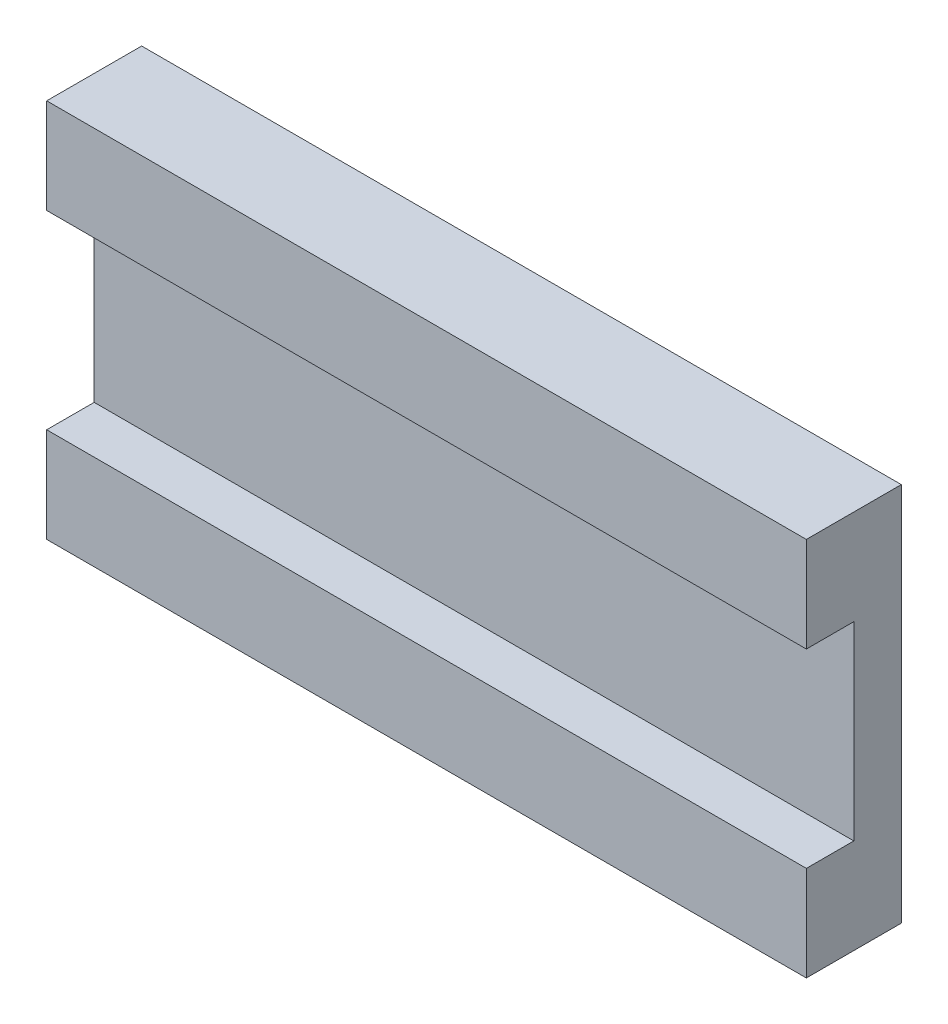
ISO-10303-21;
HEADER;
FILE_DESCRIPTION(('STEP AP214'),'2;1');
FILE_NAME('part.step','',(''),(''),'','','');
FILE_SCHEMA(('AUTOMOTIVE_DESIGN { 1 0 10303 214 1 1 1 1 }'));
ENDSEC;
DATA;
#1=APPLICATION_CONTEXT('core data for automotive mechanical design processes');
#2=APPLICATION_PROTOCOL_DEFINITION('international standard','automotive_design',2000,#1);
#3=PRODUCT_CONTEXT('',#1,'mechanical');
#4=PRODUCT('Part','Part','',(#3));
#5=PRODUCT_RELATED_PRODUCT_CATEGORY('part','',(#4));
#6=PRODUCT_DEFINITION_FORMATION('','',#4);
#7=PRODUCT_DEFINITION_CONTEXT('part definition',#1,'design');
#8=PRODUCT_DEFINITION('design','',#6,#7);
#9=PRODUCT_DEFINITION_SHAPE('','',#8);
#10=(LENGTH_UNIT() NAMED_UNIT(*) SI_UNIT(.MILLI.,.METRE.));
#11=(NAMED_UNIT(*) PLANE_ANGLE_UNIT() SI_UNIT($,.RADIAN.));
#12=(NAMED_UNIT(*) SI_UNIT($,.STERADIAN.) SOLID_ANGLE_UNIT());
#13=UNCERTAINTY_MEASURE_WITH_UNIT(LENGTH_MEASURE(1.E-05),#10,'distance_accuracy_value','');
#14=(GEOMETRIC_REPRESENTATION_CONTEXT(3) GLOBAL_UNCERTAINTY_ASSIGNED_CONTEXT((#13)) GLOBAL_UNIT_ASSIGNED_CONTEXT((#10,
#11,#12)) REPRESENTATION_CONTEXT('',''));
#15=CARTESIAN_POINT('',(0.,0.,0.));
#16=DIRECTION('',(0.,0.,1.));
#17=DIRECTION('',(1.,0.,0.));
#18=AXIS2_PLACEMENT_3D('',#15,#16,#17);
#19=CARTESIAN_POINT('',(-160.,-35.0938844126674,20.));
#20=DIRECTION('',(0.,-1.,0.));
#21=DIRECTION('',(0.,0.,-1.));
#22=AXIS2_PLACEMENT_3D('',#19,#20,#21);
#23=PLANE('',#22);
#24=DIRECTION('',(0.,0.,-1.));
#25=VECTOR('',#24,1.);
#26=CARTESIAN_POINT('',(0.,-35.0938844126674,20.));
#27=LINE('',#26,#25);
#28=CARTESIAN_POINT('',(0.,-35.0938844126674,20.));
#29=VERTEX_POINT('',#28);
#30=CARTESIAN_POINT('',(0.,-35.0938844126674,0.));
#31=VERTEX_POINT('',#30);
#32=EDGE_CURVE('E138',#29,#31,#27,.T.);
#33=ORIENTED_EDGE('',*,*,#32,.F.);
#34=DIRECTION('',(1.,0.,0.));
#35=VECTOR('',#34,1.);
#36=CARTESIAN_POINT('',(-160.,-35.0938844126674,20.));
#37=LINE('',#36,#35);
#38=CARTESIAN_POINT('',(-160.,-35.0938844126674,20.));
#39=VERTEX_POINT('',#38);
#40=EDGE_CURVE('E11',#39,#29,#37,.T.);
#41=ORIENTED_EDGE('',*,*,#40,.F.);
#42=DIRECTION('',(0.,0.,-1.));
#43=VECTOR('',#42,1.);
#44=CARTESIAN_POINT('',(-160.,-35.0938844126674,20.));
#45=LINE('',#44,#43);
#46=CARTESIAN_POINT('',(-160.,-35.0938844126674,0.));
#47=VERTEX_POINT('',#46);
#48=EDGE_CURVE('E158',#39,#47,#45,.T.);
#49=ORIENTED_EDGE('',*,*,#48,.T.);
#50=DIRECTION('',(1.,0.,0.));
#51=VECTOR('',#50,1.);
#52=CARTESIAN_POINT('',(-160.,-35.0938844126674,0.));
#53=LINE('',#52,#51);
#54=EDGE_CURVE('E44',#47,#31,#53,.T.);
#55=ORIENTED_EDGE('',*,*,#54,.T.);
#56=EDGE_LOOP('',(#33,#41,#49,#55));
#57=FACE_BOUND('',#56,.T.);
#58=ADVANCED_FACE('F41',(#57),#23,.T.);
#59=CARTESIAN_POINT('',(-160.,-15.0938844126674,20.));
#60=DIRECTION('',(0.,0.,1.));
#61=DIRECTION('',(0.,-1.,0.));
#62=AXIS2_PLACEMENT_3D('',#59,#60,#61);
#63=PLANE('',#62);
#64=DIRECTION('',(0.,-1.,0.));
#65=VECTOR('',#64,1.);
#66=CARTESIAN_POINT('',(0.,-15.0938844126674,20.));
#67=LINE('',#66,#65);
#68=CARTESIAN_POINT('',(0.,-15.0938844126674,20.));
#69=VERTEX_POINT('',#68);
#70=EDGE_CURVE('E156',#69,#29,#67,.T.);
#71=ORIENTED_EDGE('',*,*,#70,.F.);
#72=DIRECTION('',(1.,0.,0.));
#73=VECTOR('',#72,1.);
#74=CARTESIAN_POINT('',(-160.,-15.0938844126674,20.));
#75=LINE('',#74,#73);
#76=CARTESIAN_POINT('',(-160.,-15.0938844126674,20.));
#77=VERTEX_POINT('',#76);
#78=EDGE_CURVE('E50',#77,#69,#75,.T.);
#79=ORIENTED_EDGE('',*,*,#78,.F.);
#80=DIRECTION('',(0.,-1.,0.));
#81=VECTOR('',#80,1.);
#82=CARTESIAN_POINT('',(-160.,-15.0938844126674,20.));
#83=LINE('',#82,#81);
#84=EDGE_CURVE('E128',#77,#39,#83,.T.);
#85=ORIENTED_EDGE('',*,*,#84,.T.);
#86=ORIENTED_EDGE('',*,*,#40,.T.);
#87=EDGE_LOOP('',(#71,#79,#85,#86));
#88=FACE_BOUND('',#87,.T.);
#89=ADVANCED_FACE('F170',(#88),#63,.T.);
#90=CARTESIAN_POINT('',(-160.,-15.0938844126674,9.99999999999999));
#91=DIRECTION('',(0.,1.,0.));
#92=DIRECTION('',(0.,0.,1.));
#93=AXIS2_PLACEMENT_3D('',#90,#91,#92);
#94=PLANE('',#93);
#95=DIRECTION('',(0.,0.,1.));
#96=VECTOR('',#95,1.);
#97=CARTESIAN_POINT('',(0.,-15.0938844126674,9.99999999999999));
#98=LINE('',#97,#96);
#99=CARTESIAN_POINT('',(0.,-15.0938844126674,9.99999999999999));
#100=VERTEX_POINT('',#99);
#101=EDGE_CURVE('E115',#100,#69,#98,.T.);
#102=ORIENTED_EDGE('',*,*,#101,.F.);
#103=DIRECTION('',(1.,0.,0.));
#104=VECTOR('',#103,1.);
#105=CARTESIAN_POINT('',(-160.,-15.0938844126674,9.99999999999999));
#106=LINE('',#105,#104);
#107=CARTESIAN_POINT('',(-160.,-15.0938844126674,9.99999999999999));
#108=VERTEX_POINT('',#107);
#109=EDGE_CURVE('E110',#108,#100,#106,.T.);
#110=ORIENTED_EDGE('',*,*,#109,.F.);
#111=DIRECTION('',(0.,0.,1.));
#112=VECTOR('',#111,1.);
#113=CARTESIAN_POINT('',(-160.,-15.0938844126674,9.99999999999999));
#114=LINE('',#113,#112);
#115=EDGE_CURVE('E113',#108,#77,#114,.T.);
#116=ORIENTED_EDGE('',*,*,#115,.T.);
#117=ORIENTED_EDGE('',*,*,#78,.T.);
#118=EDGE_LOOP('',(#102,#110,#116,#117));
#119=FACE_BOUND('',#118,.T.);
#120=ADVANCED_FACE('F112',(#119),#94,.T.);
#121=CARTESIAN_POINT('',(-160.,24.9061155873326,9.99999999999999));
#122=DIRECTION('',(0.,0.,1.));
#123=DIRECTION('',(0.,-1.,0.));
#124=AXIS2_PLACEMENT_3D('',#121,#122,#123);
#125=PLANE('',#124);
#126=DIRECTION('',(0.,-1.,0.));
#127=VECTOR('',#126,1.);
#128=CARTESIAN_POINT('',(0.,24.9061155873326,9.99999999999999));
#129=LINE('',#128,#127);
#130=CARTESIAN_POINT('',(0.,24.9061155873326,9.99999999999999));
#131=VERTEX_POINT('',#130);
#132=EDGE_CURVE('E153',#131,#100,#129,.T.);
#133=ORIENTED_EDGE('',*,*,#132,.F.);
#134=DIRECTION('',(1.,0.,0.));
#135=VECTOR('',#134,1.);
#136=CARTESIAN_POINT('',(-160.,24.9061155873326,9.99999999999999));
#137=LINE('',#136,#135);
#138=CARTESIAN_POINT('',(-160.,24.9061155873326,9.99999999999999));
#139=VERTEX_POINT('',#138);
#140=EDGE_CURVE('E120',#139,#131,#137,.T.);
#141=ORIENTED_EDGE('',*,*,#140,.F.);
#142=DIRECTION('',(0.,-1.,0.));
#143=VECTOR('',#142,1.);
#144=CARTESIAN_POINT('',(-160.,24.9061155873326,9.99999999999999));
#145=LINE('',#144,#143);
#146=EDGE_CURVE('E126',#139,#108,#145,.T.);
#147=ORIENTED_EDGE('',*,*,#146,.T.);
#148=ORIENTED_EDGE('',*,*,#109,.T.);
#149=EDGE_LOOP('',(#133,#141,#147,#148));
#150=FACE_BOUND('',#149,.T.);
#151=ADVANCED_FACE('F130',(#150),#125,.T.);
#152=CARTESIAN_POINT('',(-160.,24.9061155873326,20.));
#153=DIRECTION('',(0.,-1.,0.));
#154=DIRECTION('',(0.,0.,-1.));
#155=AXIS2_PLACEMENT_3D('',#152,#153,#154);
#156=PLANE('',#155);
#157=DIRECTION('',(0.,0.,-1.));
#158=VECTOR('',#157,1.);
#159=CARTESIAN_POINT('',(0.,24.9061155873326,20.));
#160=LINE('',#159,#158);
#161=CARTESIAN_POINT('',(0.,24.9061155873326,20.));
#162=VERTEX_POINT('',#161);
#163=EDGE_CURVE('E150',#162,#131,#160,.T.);
#164=ORIENTED_EDGE('',*,*,#163,.F.);
#165=DIRECTION('',(1.,0.,0.));
#166=VECTOR('',#165,1.);
#167=CARTESIAN_POINT('',(-160.,24.9061155873326,20.));
#168=LINE('',#167,#166);
#169=CARTESIAN_POINT('',(-160.,24.9061155873326,20.));
#170=VERTEX_POINT('',#169);
#171=EDGE_CURVE('E162',#170,#162,#168,.T.);
#172=ORIENTED_EDGE('',*,*,#171,.F.);
#173=DIRECTION('',(0.,0.,-1.));
#174=VECTOR('',#173,1.);
#175=CARTESIAN_POINT('',(-160.,24.9061155873326,20.));
#176=LINE('',#175,#174);
#177=EDGE_CURVE('E131',#170,#139,#176,.T.);
#178=ORIENTED_EDGE('',*,*,#177,.T.);
#179=ORIENTED_EDGE('',*,*,#140,.T.);
#180=EDGE_LOOP('',(#164,#172,#178,#179));
#181=FACE_BOUND('',#180,.T.);
#182=ADVANCED_FACE('F183',(#181),#156,.T.);
#183=CARTESIAN_POINT('',(-160.,44.9061155873326,20.));
#184=DIRECTION('',(0.,0.,1.));
#185=DIRECTION('',(0.,-1.,0.));
#186=AXIS2_PLACEMENT_3D('',#183,#184,#185);
#187=PLANE('',#186);
#188=DIRECTION('',(0.,-1.,0.));
#189=VECTOR('',#188,1.);
#190=CARTESIAN_POINT('',(0.,44.9061155873326,20.));
#191=LINE('',#190,#189);
#192=CARTESIAN_POINT('',(0.,44.9061155873326,20.));
#193=VERTEX_POINT('',#192);
#194=EDGE_CURVE('E147',#193,#162,#191,.T.);
#195=ORIENTED_EDGE('',*,*,#194,.F.);
#196=DIRECTION('',(1.,0.,0.));
#197=VECTOR('',#196,1.);
#198=CARTESIAN_POINT('',(-160.,44.9061155873326,20.));
#199=LINE('',#198,#197);
#200=CARTESIAN_POINT('',(-160.,44.9061155873326,20.));
#201=VERTEX_POINT('',#200);
#202=EDGE_CURVE('E164',#201,#193,#199,.T.);
#203=ORIENTED_EDGE('',*,*,#202,.F.);
#204=DIRECTION('',(0.,-1.,0.));
#205=VECTOR('',#204,1.);
#206=CARTESIAN_POINT('',(-160.,44.9061155873326,20.));
#207=LINE('',#206,#205);
#208=EDGE_CURVE('E133',#201,#170,#207,.T.);
#209=ORIENTED_EDGE('',*,*,#208,.T.);
#210=ORIENTED_EDGE('',*,*,#171,.T.);
#211=EDGE_LOOP('',(#195,#203,#209,#210));
#212=FACE_BOUND('',#211,.T.);
#213=ADVANCED_FACE('F186',(#212),#187,.T.);
#214=CARTESIAN_POINT('',(-160.,44.9061155873326,0.));
#215=DIRECTION('',(0.,1.,0.));
#216=DIRECTION('',(0.,0.,1.));
#217=AXIS2_PLACEMENT_3D('',#214,#215,#216);
#218=PLANE('',#217);
#219=DIRECTION('',(0.,0.,1.));
#220=VECTOR('',#219,1.);
#221=CARTESIAN_POINT('',(0.,44.9061155873326,0.));
#222=LINE('',#221,#220);
#223=CARTESIAN_POINT('',(0.,44.9061155873326,0.));
#224=VERTEX_POINT('',#223);
#225=EDGE_CURVE('E144',#224,#193,#222,.T.);
#226=ORIENTED_EDGE('',*,*,#225,.F.);
#227=DIRECTION('',(1.,0.,0.));
#228=VECTOR('',#227,1.);
#229=CARTESIAN_POINT('',(-160.,44.9061155873326,0.));
#230=LINE('',#229,#228);
#231=CARTESIAN_POINT('',(-160.,44.9061155873326,0.));
#232=VERTEX_POINT('',#231);
#233=EDGE_CURVE('E165',#232,#224,#230,.T.);
#234=ORIENTED_EDGE('',*,*,#233,.F.);
#235=DIRECTION('',(0.,0.,1.));
#236=VECTOR('',#235,1.);
#237=CARTESIAN_POINT('',(-160.,44.9061155873326,0.));
#238=LINE('',#237,#236);
#239=EDGE_CURVE('E261',#232,#201,#238,.T.);
#240=ORIENTED_EDGE('',*,*,#239,.T.);
#241=ORIENTED_EDGE('',*,*,#202,.T.);
#242=EDGE_LOOP('',(#226,#234,#240,#241));
#243=FACE_BOUND('',#242,.T.);
#244=ADVANCED_FACE('F190',(#243),#218,.T.);
#245=CARTESIAN_POINT('',(-160.,-35.0938844126674,0.));
#246=DIRECTION('',(0.,0.,-1.));
#247=DIRECTION('',(-1.,0.,0.));
#248=AXIS2_PLACEMENT_3D('',#245,#246,#247);
#249=PLANE('',#248);
#250=DIRECTION('',(0.,1.,0.));
#251=VECTOR('',#250,1.);
#252=CARTESIAN_POINT('',(0.,-35.0938844126674,0.));
#253=LINE('',#252,#251);
#254=EDGE_CURVE('E141',#31,#224,#253,.T.);
#255=ORIENTED_EDGE('',*,*,#254,.F.);
#256=ORIENTED_EDGE('',*,*,#54,.F.);
#257=DIRECTION('',(0.,1.,0.));
#258=VECTOR('',#257,1.);
#259=CARTESIAN_POINT('',(-160.,-35.0938844126674,0.));
#260=LINE('',#259,#258);
#261=EDGE_CURVE('E262',#47,#232,#260,.T.);
#262=ORIENTED_EDGE('',*,*,#261,.T.);
#263=ORIENTED_EDGE('',*,*,#233,.T.);
#264=EDGE_LOOP('',(#255,#256,#262,#263));
#265=FACE_BOUND('',#264,.T.);
#266=ADVANCED_FACE('F167',(#265),#249,.T.);
#267=CARTESIAN_POINT('',(-160.,0.,0.));
#268=DIRECTION('',(1.,0.,0.));
#269=DIRECTION('',(0.,0.,-1.));
#270=AXIS2_PLACEMENT_3D('',#267,#268,#269);
#271=PLANE('',#270);
#272=ORIENTED_EDGE('',*,*,#48,.F.);
#273=ORIENTED_EDGE('',*,*,#84,.F.);
#274=ORIENTED_EDGE('',*,*,#115,.F.);
#275=ORIENTED_EDGE('',*,*,#146,.F.);
#276=ORIENTED_EDGE('',*,*,#177,.F.);
#277=ORIENTED_EDGE('',*,*,#208,.F.);
#278=ORIENTED_EDGE('',*,*,#239,.F.);
#279=ORIENTED_EDGE('',*,*,#261,.F.);
#280=EDGE_LOOP('',(#272,#273,#274,#275,#276,#277,#278,#279));
#281=FACE_BOUND('',#280,.T.);
#282=ADVANCED_FACE('F124',(#281),#271,.F.);
#283=CARTESIAN_POINT('',(0.,0.,0.));
#284=DIRECTION('',(1.,0.,0.));
#285=DIRECTION('',(0.,0.,-1.));
#286=AXIS2_PLACEMENT_3D('',#283,#284,#285);
#287=PLANE('',#286);
#288=ORIENTED_EDGE('',*,*,#32,.T.);
#289=ORIENTED_EDGE('',*,*,#254,.T.);
#290=ORIENTED_EDGE('',*,*,#225,.T.);
#291=ORIENTED_EDGE('',*,*,#194,.T.);
#292=ORIENTED_EDGE('',*,*,#163,.T.);
#293=ORIENTED_EDGE('',*,*,#132,.T.);
#294=ORIENTED_EDGE('',*,*,#101,.T.);
#295=ORIENTED_EDGE('',*,*,#70,.T.);
#296=EDGE_LOOP('',(#288,#289,#290,#291,#292,#293,#294,#295));
#297=FACE_BOUND('',#296,.T.);
#298=ADVANCED_FACE('F169',(#297),#287,.T.);
#299=CLOSED_SHELL('',(#58,#89,#120,#151,#182,#213,#244,#266,#282,#298));
#300=MANIFOLD_SOLID_BREP('B2',#299);
#301=ADVANCED_BREP_SHAPE_REPRESENTATION('',(#18,#300),#14);
#302=SHAPE_DEFINITION_REPRESENTATION(#9,#301);
ENDSEC;
END-ISO-10303-21;
